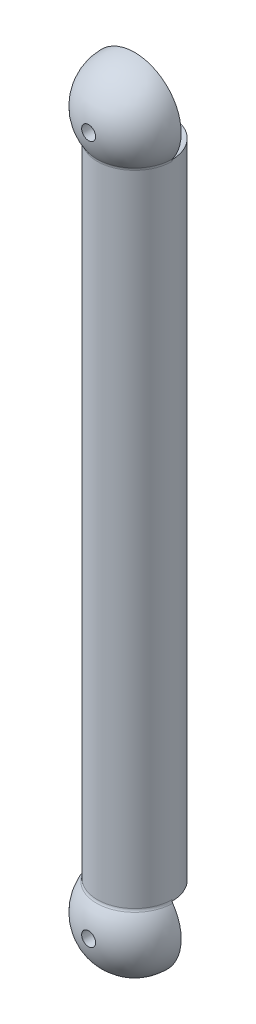
ISO-10303-21;
HEADER;
FILE_DESCRIPTION(('STEP AP214'),'2;1');
FILE_NAME('part.step','',(''),(''),'','','');
FILE_SCHEMA(('AUTOMOTIVE_DESIGN { 1 0 10303 214 1 1 1 1 }'));
ENDSEC;
DATA;
#1=APPLICATION_CONTEXT('core data for automotive mechanical design processes');
#2=APPLICATION_PROTOCOL_DEFINITION('international standard','automotive_design',2000,#1);
#3=PRODUCT_CONTEXT('',#1,'mechanical');
#4=PRODUCT('Part','Part','',(#3));
#5=PRODUCT_RELATED_PRODUCT_CATEGORY('part','',(#4));
#6=PRODUCT_DEFINITION_FORMATION('','',#4);
#7=PRODUCT_DEFINITION_CONTEXT('part definition',#1,'design');
#8=PRODUCT_DEFINITION('design','',#6,#7);
#9=PRODUCT_DEFINITION_SHAPE('','',#8);
#10=(LENGTH_UNIT() NAMED_UNIT(*) SI_UNIT(.MILLI.,.METRE.));
#11=(NAMED_UNIT(*) PLANE_ANGLE_UNIT() SI_UNIT($,.RADIAN.));
#12=(NAMED_UNIT(*) SI_UNIT($,.STERADIAN.) SOLID_ANGLE_UNIT());
#13=UNCERTAINTY_MEASURE_WITH_UNIT(LENGTH_MEASURE(1.E-05),#10,'distance_accuracy_value','');
#14=(GEOMETRIC_REPRESENTATION_CONTEXT(3) GLOBAL_UNCERTAINTY_ASSIGNED_CONTEXT((#13)) GLOBAL_UNIT_ASSIGNED_CONTEXT((#10,
#11,#12)) REPRESENTATION_CONTEXT('',''));
#15=CARTESIAN_POINT('',(0.,0.,0.));
#16=DIRECTION('',(0.,0.,1.));
#17=DIRECTION('',(1.,0.,0.));
#18=AXIS2_PLACEMENT_3D('',#15,#16,#17);
#19=CARTESIAN_POINT('',(0.,0.,0.));
#20=DIRECTION('',(0.,0.,-1.));
#21=DIRECTION('',(-1.,0.,0.));
#22=AXIS2_PLACEMENT_3D('',#19,#20,#21);
#23=PLANE('',#22);
#24=CARTESIAN_POINT('',(0.,150.,0.));
#25=DIRECTION('',(0.,0.,-1.));
#26=DIRECTION('',(-1.,0.,0.));
#27=AXIS2_PLACEMENT_3D('',#24,#25,#26);
#28=CIRCLE('',#27,1.5);
#29=CARTESIAN_POINT('',(-1.5,150.,0.));
#30=VERTEX_POINT('',#29);
#31=EDGE_CURVE('E105',#30,#30,#28,.T.);
#32=ORIENTED_EDGE('',*,*,#31,.F.);
#33=EDGE_LOOP('',(#32));
#34=FACE_BOUND('',#33,.T.);
#35=CARTESIAN_POINT('',(0.,150.,0.));
#36=DIRECTION('',(0.,0.,-1.));
#37=DIRECTION('',(-1.,0.,0.));
#38=AXIS2_PLACEMENT_3D('',#35,#36,#37);
#39=CIRCLE('',#38,10.);
#40=CARTESIAN_POINT('',(7.99999999999998,144.,0.));
#41=VERTEX_POINT('',#40);
#42=CARTESIAN_POINT('',(-7.99999999999998,144.,0.));
#43=VERTEX_POINT('',#42);
#44=EDGE_CURVE('E104',#41,#43,#39,.T.);
#45=ORIENTED_EDGE('',*,*,#44,.T.);
#46=DIRECTION('',(0.,-1.,0.));
#47=VECTOR('',#46,1.);
#48=CARTESIAN_POINT('',(-7.99999999999998,143.675444679663,0.));
#49=LINE('',#48,#47);
#50=CARTESIAN_POINT('',(-7.99999999999998,143.675444679663,0.));
#51=VERTEX_POINT('',#50);
#52=EDGE_CURVE('E93',#51,#43,#49,.F.);
#53=ORIENTED_EDGE('',*,*,#52,.F.);
#54=CARTESIAN_POINT('',(-8.99999999999998,143.675444679663,0.));
#55=DIRECTION('',(0.,0.,-1.));
#56=DIRECTION('',(-1.,0.,0.));
#57=AXIS2_PLACEMENT_3D('',#54,#55,#56);
#58=CIRCLE('',#57,1.);
#59=CARTESIAN_POINT('',(-8.18181818181818,144.250404254239,0.));
#60=VERTEX_POINT('',#59);
#61=EDGE_CURVE('E47',#51,#60,#58,.F.);
#62=ORIENTED_EDGE('',*,*,#61,.T.);
#63=CARTESIAN_POINT('',(0.,150.,0.));
#64=DIRECTION('',(0.,0.,-1.));
#65=DIRECTION('',(-1.,0.,0.));
#66=AXIS2_PLACEMENT_3D('',#63,#64,#65);
#67=CIRCLE('',#66,10.);
#68=CARTESIAN_POINT('',(8.18181818181818,144.250404254239,0.));
#69=VERTEX_POINT('',#68);
#70=EDGE_CURVE('E127',#60,#69,#67,.T.);
#71=ORIENTED_EDGE('',*,*,#70,.T.);
#72=CARTESIAN_POINT('',(8.99999999999998,143.675444679663,0.));
#73=DIRECTION('',(0.,0.,-1.));
#74=DIRECTION('',(-1.,0.,0.));
#75=AXIS2_PLACEMENT_3D('',#72,#73,#74);
#76=CIRCLE('',#75,1.);
#77=CARTESIAN_POINT('',(7.99999999999998,143.675444679663,0.));
#78=VERTEX_POINT('',#77);
#79=EDGE_CURVE('E11',#69,#78,#76,.F.);
#80=ORIENTED_EDGE('',*,*,#79,.T.);
#81=DIRECTION('',(0.,-1.,0.));
#82=VECTOR('',#81,1.);
#83=CARTESIAN_POINT('',(7.99999999999998,144.,0.));
#84=LINE('',#83,#82);
#85=EDGE_CURVE('E53',#41,#78,#84,.T.);
#86=ORIENTED_EDGE('',*,*,#85,.F.);
#87=EDGE_LOOP('',(#45,#53,#62,#71,#80,#86));
#88=FACE_BOUND('',#87,.T.);
#89=ADVANCED_FACE('F39',(#34,#88),#23,.T.);
#90=CARTESIAN_POINT('',(0.,0.,0.));
#91=DIRECTION('',(0.,0.,-1.));
#92=DIRECTION('',(-1.,0.,0.));
#93=AXIS2_PLACEMENT_3D('',#90,#91,#92);
#94=CIRCLE('',#93,1.5);
#95=CARTESIAN_POINT('',(-1.5,0.,0.));
#96=VERTEX_POINT('',#95);
#97=EDGE_CURVE('E113',#96,#96,#94,.T.);
#98=ORIENTED_EDGE('',*,*,#97,.F.);
#99=EDGE_LOOP('',(#98));
#100=FACE_BOUND('',#99,.T.);
#101=CARTESIAN_POINT('',(0.,0.,0.));
#102=DIRECTION('',(0.,0.,-1.));
#103=DIRECTION('',(-1.,0.,0.));
#104=AXIS2_PLACEMENT_3D('',#101,#102,#103);
#105=CIRCLE('',#104,10.);
#106=CARTESIAN_POINT('',(-7.99999999999998,6.00000000000002,0.));
#107=VERTEX_POINT('',#106);
#108=CARTESIAN_POINT('',(7.99999999999998,6.00000000000002,0.));
#109=VERTEX_POINT('',#108);
#110=EDGE_CURVE('E108',#107,#109,#105,.T.);
#111=ORIENTED_EDGE('',*,*,#110,.T.);
#112=DIRECTION('',(0.,-1.,0.));
#113=VECTOR('',#112,1.);
#114=CARTESIAN_POINT('',(7.99999999999998,6.32455532033678,0.));
#115=LINE('',#114,#113);
#116=CARTESIAN_POINT('',(7.99999999999998,6.32455532033678,0.));
#117=VERTEX_POINT('',#116);
#118=EDGE_CURVE('E100',#117,#109,#115,.T.);
#119=ORIENTED_EDGE('',*,*,#118,.F.);
#120=CARTESIAN_POINT('',(8.99999999999998,6.32455532033678,0.));
#121=DIRECTION('',(0.,0.,-1.));
#122=DIRECTION('',(-1.,0.,0.));
#123=AXIS2_PLACEMENT_3D('',#120,#121,#122);
#124=CIRCLE('',#123,1.);
#125=CARTESIAN_POINT('',(8.18181818181817,5.74959574576071,0.));
#126=VERTEX_POINT('',#125);
#127=EDGE_CURVE('E144',#117,#126,#124,.F.);
#128=ORIENTED_EDGE('',*,*,#127,.T.);
#129=CARTESIAN_POINT('',(0.,0.,0.));
#130=DIRECTION('',(0.,0.,-1.));
#131=DIRECTION('',(-1.,0.,0.));
#132=AXIS2_PLACEMENT_3D('',#129,#130,#131);
#133=CIRCLE('',#132,10.);
#134=CARTESIAN_POINT('',(-8.18181818181817,5.74959574576071,0.));
#135=VERTEX_POINT('',#134);
#136=EDGE_CURVE('E124',#126,#135,#133,.T.);
#137=ORIENTED_EDGE('',*,*,#136,.T.);
#138=CARTESIAN_POINT('',(-8.99999999999998,6.32455532033678,0.));
#139=DIRECTION('',(0.,0.,-1.));
#140=DIRECTION('',(-1.,0.,0.));
#141=AXIS2_PLACEMENT_3D('',#138,#139,#140);
#142=CIRCLE('',#141,1.);
#143=CARTESIAN_POINT('',(-7.99999999999998,6.32455532033678,0.));
#144=VERTEX_POINT('',#143);
#145=EDGE_CURVE('E142',#135,#144,#142,.F.);
#146=ORIENTED_EDGE('',*,*,#145,.T.);
#147=DIRECTION('',(0.,-1.,0.));
#148=VECTOR('',#147,1.);
#149=CARTESIAN_POINT('',(-7.99999999999998,6.00000000000002,0.));
#150=LINE('',#149,#148);
#151=EDGE_CURVE('E61',#107,#144,#150,.F.);
#152=ORIENTED_EDGE('',*,*,#151,.F.);
#153=EDGE_LOOP('',(#111,#119,#128,#137,#146,#152));
#154=FACE_BOUND('',#153,.T.);
#155=ADVANCED_FACE('F159',(#100,#154),#23,.T.);
#156=CARTESIAN_POINT('',(0.,0.,0.));
#157=DIRECTION('',(0.,-1.,0.));
#158=DIRECTION('',(1.,0.,0.));
#159=AXIS2_PLACEMENT_3D('',#156,#157,#158);
#160=SPHERICAL_SURFACE('',#159,10.);
#161=CARTESIAN_POINT('',(0.,0.,9.88685996664259));
#162=DIRECTION('',(0.,0.,-1.));
#163=DIRECTION('',(-1.,0.,0.));
#164=AXIS2_PLACEMENT_3D('',#161,#162,#163);
#165=CIRCLE('',#164,1.5);
#166=CARTESIAN_POINT('',(-1.49999999999993,0.,9.8868599666426));
#167=VERTEX_POINT('',#166);
#168=EDGE_CURVE('E121',#167,#167,#165,.T.);
#169=ORIENTED_EDGE('',*,*,#168,.T.);
#170=EDGE_LOOP('',(#169));
#171=FACE_BOUND('',#170,.T.);
#172=ORIENTED_EDGE('',*,*,#136,.F.);
#173=CARTESIAN_POINT('',(0.,5.74959574576071,0.));
#174=DIRECTION('',(0.,-1.,0.));
#175=DIRECTION('',(0.,0.,-1.));
#176=AXIS2_PLACEMENT_3D('',#173,#174,#175);
#177=CIRCLE('',#176,8.18181818181817);
#178=EDGE_CURVE('E130',#126,#135,#177,.T.);
#179=ORIENTED_EDGE('',*,*,#178,.T.);
#180=EDGE_LOOP('',(#172,#179));
#181=FACE_BOUND('',#180,.T.);
#182=ADVANCED_FACE('F166',(#171,#181),#160,.T.);
#183=CARTESIAN_POINT('',(0.,150.,0.));
#184=DIRECTION('',(0.,-1.,0.));
#185=DIRECTION('',(-1.,0.,0.));
#186=AXIS2_PLACEMENT_3D('',#183,#184,#185);
#187=SPHERICAL_SURFACE('',#186,10.);
#188=CARTESIAN_POINT('',(0.,150.,9.8868599666426));
#189=DIRECTION('',(0.,0.,-1.));
#190=DIRECTION('',(-1.,0.,0.));
#191=AXIS2_PLACEMENT_3D('',#188,#189,#190);
#192=CIRCLE('',#191,1.5);
#193=CARTESIAN_POINT('',(-1.49999999999994,150.,9.88685996664261));
#194=VERTEX_POINT('',#193);
#195=EDGE_CURVE('E116',#194,#194,#192,.T.);
#196=ORIENTED_EDGE('',*,*,#195,.T.);
#197=EDGE_LOOP('',(#196));
#198=FACE_BOUND('',#197,.T.);
#199=ORIENTED_EDGE('',*,*,#70,.F.);
#200=CARTESIAN_POINT('',(0.,144.250404254239,0.));
#201=DIRECTION('',(0.,0.999999999999999,0.));
#202=DIRECTION('',(0.,0.,1.));
#203=AXIS2_PLACEMENT_3D('',#200,#201,#202);
#204=CIRCLE('',#203,8.18181818181817);
#205=EDGE_CURVE('E140',#60,#69,#204,.T.);
#206=ORIENTED_EDGE('',*,*,#205,.T.);
#207=EDGE_LOOP('',(#199,#206));
#208=FACE_BOUND('',#207,.T.);
#209=ADVANCED_FACE('F150',(#198,#208),#187,.T.);
#210=CARTESIAN_POINT('',(0.,0.,0.));
#211=DIRECTION('',(0.,-1.,0.));
#212=DIRECTION('',(0.,0.,-1.));
#213=AXIS2_PLACEMENT_3D('',#210,#211,#212);
#214=CYLINDRICAL_SURFACE('',#213,7.99999999999998);
#215=CARTESIAN_POINT('',(0.,6.00000000000003,0.));
#216=DIRECTION('',(0.,1.,0.));
#217=DIRECTION('',(0.,0.,1.));
#218=AXIS2_PLACEMENT_3D('',#215,#216,#217);
#219=CIRCLE('',#218,7.99999999999998);
#220=EDGE_CURVE('E106',#109,#107,#219,.T.);
#221=ORIENTED_EDGE('',*,*,#220,.T.);
#222=ORIENTED_EDGE('',*,*,#151,.T.);
#223=CARTESIAN_POINT('',(0.,6.32455532033678,0.));
#224=DIRECTION('',(0.,-1.,0.));
#225=DIRECTION('',(0.,0.,-1.));
#226=AXIS2_PLACEMENT_3D('',#223,#224,#225);
#227=CIRCLE('',#226,7.99999999999998);
#228=EDGE_CURVE('E136',#144,#117,#227,.F.);
#229=ORIENTED_EDGE('',*,*,#228,.T.);
#230=ORIENTED_EDGE('',*,*,#118,.T.);
#231=EDGE_LOOP('',(#221,#222,#229,#230));
#232=FACE_BOUND('',#231,.T.);
#233=CARTESIAN_POINT('',(0.,143.675444679663,0.));
#234=DIRECTION('',(0.,0.999999999999999,0.));
#235=DIRECTION('',(0.,0.,1.));
#236=AXIS2_PLACEMENT_3D('',#233,#234,#235);
#237=CIRCLE('',#236,7.99999999999998);
#238=EDGE_CURVE('E99',#78,#51,#237,.F.);
#239=ORIENTED_EDGE('',*,*,#238,.T.);
#240=ORIENTED_EDGE('',*,*,#52,.T.);
#241=CARTESIAN_POINT('',(0.,144.,0.));
#242=DIRECTION('',(0.,1.,0.));
#243=DIRECTION('',(0.,0.,1.));
#244=AXIS2_PLACEMENT_3D('',#241,#242,#243);
#245=CIRCLE('',#244,7.99999999999998);
#246=EDGE_CURVE('E96',#41,#43,#245,.T.);
#247=ORIENTED_EDGE('',*,*,#246,.F.);
#248=ORIENTED_EDGE('',*,*,#85,.T.);
#249=EDGE_LOOP('',(#239,#240,#247,#248));
#250=FACE_BOUND('',#249,.T.);
#251=ADVANCED_FACE('F95',(#232,#250),#214,.T.);
#252=CARTESIAN_POINT('',(0.,150.,10.0000000000001));
#253=DIRECTION('',(0.,0.,-1.));
#254=DIRECTION('',(-1.,0.,0.));
#255=AXIS2_PLACEMENT_3D('',#252,#253,#254);
#256=CYLINDRICAL_SURFACE('',#255,1.5);
#257=ORIENTED_EDGE('',*,*,#31,.T.);
#258=EDGE_LOOP('',(#257));
#259=FACE_BOUND('',#258,.T.);
#260=ORIENTED_EDGE('',*,*,#195,.F.);
#261=EDGE_LOOP('',(#260));
#262=FACE_BOUND('',#261,.T.);
#263=ADVANCED_FACE('F171',(#259,#262),#256,.F.);
#264=CARTESIAN_POINT('',(0.,0.,10.0000000000001));
#265=DIRECTION('',(0.,0.,-1.));
#266=DIRECTION('',(-1.,0.,0.));
#267=AXIS2_PLACEMENT_3D('',#264,#265,#266);
#268=CYLINDRICAL_SURFACE('',#267,1.5);
#269=ORIENTED_EDGE('',*,*,#97,.T.);
#270=EDGE_LOOP('',(#269));
#271=FACE_BOUND('',#270,.T.);
#272=ORIENTED_EDGE('',*,*,#168,.F.);
#273=EDGE_LOOP('',(#272));
#274=FACE_BOUND('',#273,.T.);
#275=ADVANCED_FACE('F186',(#271,#274),#268,.F.);
#276=CARTESIAN_POINT('',(0.,150.,0.));
#277=DIRECTION('',(0.,1.,0.));
#278=DIRECTION('',(1.,0.,0.));
#279=AXIS2_PLACEMENT_3D('',#276,#277,#278);
#280=SPHERICAL_SURFACE('',#279,10.);
#281=ORIENTED_EDGE('',*,*,#246,.T.);
#282=ORIENTED_EDGE('',*,*,#44,.F.);
#283=EDGE_LOOP('',(#281,#282));
#284=FACE_BOUND('',#283,.T.);
#285=ADVANCED_FACE('F103',(#284),#280,.F.);
#286=CARTESIAN_POINT('',(0.,0.,0.));
#287=DIRECTION('',(0.,1.,0.));
#288=DIRECTION('',(-1.,0.,0.));
#289=AXIS2_PLACEMENT_3D('',#286,#287,#288);
#290=SPHERICAL_SURFACE('',#289,10.);
#291=ORIENTED_EDGE('',*,*,#110,.F.);
#292=ORIENTED_EDGE('',*,*,#220,.F.);
#293=EDGE_LOOP('',(#291,#292));
#294=FACE_BOUND('',#293,.T.);
#295=ADVANCED_FACE('F156',(#294),#290,.F.);
#296=CARTESIAN_POINT('',(0.,6.32455532033678,0.));
#297=DIRECTION('',(0.,-1.,0.));
#298=DIRECTION('',(0.,0.,-1.));
#299=AXIS2_PLACEMENT_3D('',#296,#297,#298);
#300=TOROIDAL_SURFACE('',#299,8.99999999999998,1.);
#301=ORIENTED_EDGE('',*,*,#127,.F.);
#302=ORIENTED_EDGE('',*,*,#228,.F.);
#303=ORIENTED_EDGE('',*,*,#145,.F.);
#304=ORIENTED_EDGE('',*,*,#178,.F.);
#305=EDGE_LOOP('',(#301,#302,#303,#304));
#306=FACE_BOUND('',#305,.T.);
#307=ADVANCED_FACE('F152',(#306),#300,.F.);
#308=CARTESIAN_POINT('',(0.,143.675444679663,0.));
#309=DIRECTION('',(0.,0.999999999999999,0.));
#310=DIRECTION('',(0.,0.,1.));
#311=AXIS2_PLACEMENT_3D('',#308,#309,#310);
#312=TOROIDAL_SURFACE('',#311,8.99999999999998,1.);
#313=ORIENTED_EDGE('',*,*,#79,.F.);
#314=ORIENTED_EDGE('',*,*,#205,.F.);
#315=ORIENTED_EDGE('',*,*,#61,.F.);
#316=ORIENTED_EDGE('',*,*,#238,.F.);
#317=EDGE_LOOP('',(#313,#314,#315,#316));
#318=FACE_BOUND('',#317,.T.);
#319=ADVANCED_FACE('F41',(#318),#312,.F.);
#320=CLOSED_SHELL('',(#89,#155,#182,#209,#251,#263,#275,#285,#295,#307,#319));
#321=MANIFOLD_SOLID_BREP('B2',#320);
#322=ADVANCED_BREP_SHAPE_REPRESENTATION('',(#18,#321),#14);
#323=SHAPE_DEFINITION_REPRESENTATION(#9,#322);
ENDSEC;
END-ISO-10303-21;
